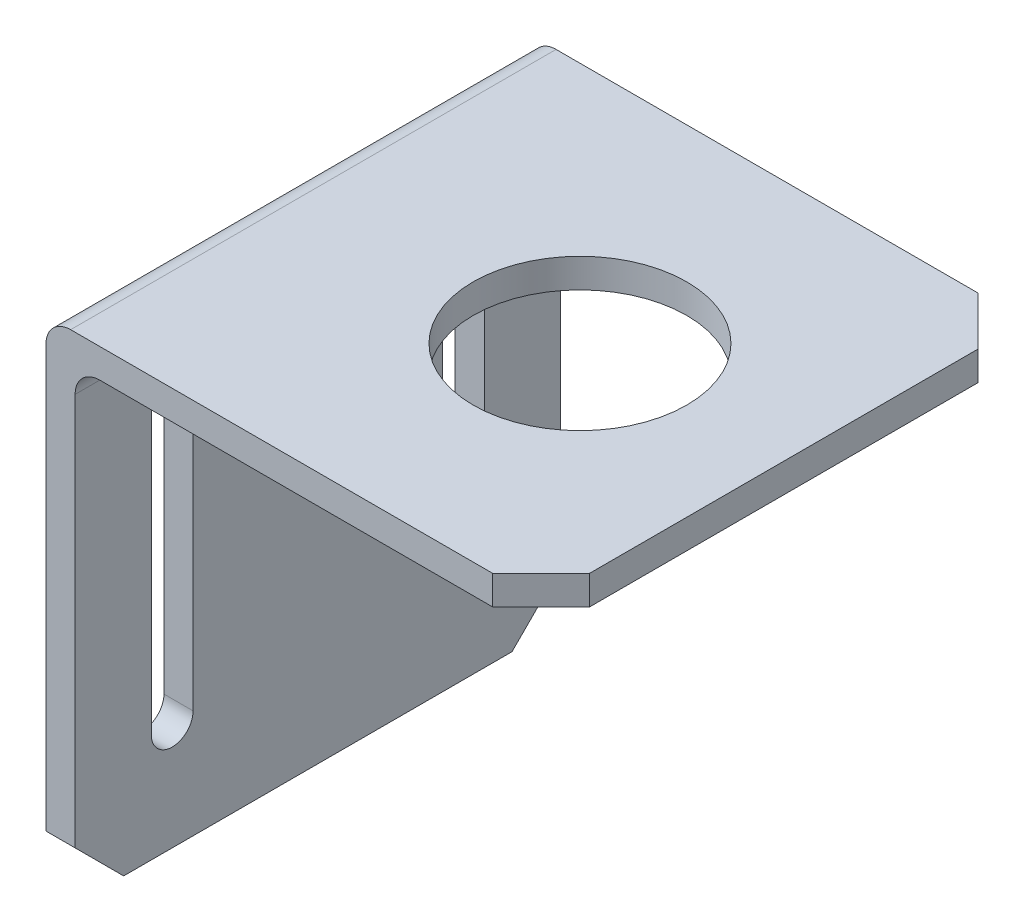
ISO-10303-21;
HEADER;
FILE_DESCRIPTION(('STEP AP214'),'2;1');
FILE_NAME('part.step','',(''),(''),'','','');
FILE_SCHEMA(('AUTOMOTIVE_DESIGN { 1 0 10303 214 1 1 1 1 }'));
ENDSEC;
DATA;
#1=APPLICATION_CONTEXT('core data for automotive mechanical design processes');
#2=APPLICATION_PROTOCOL_DEFINITION('international standard','automotive_design',2000,#1);
#3=PRODUCT_CONTEXT('',#1,'mechanical');
#4=PRODUCT('Part','Part','',(#3));
#5=PRODUCT_RELATED_PRODUCT_CATEGORY('part','',(#4));
#6=PRODUCT_DEFINITION_FORMATION('','',#4);
#7=PRODUCT_DEFINITION_CONTEXT('part definition',#1,'design');
#8=PRODUCT_DEFINITION('design','',#6,#7);
#9=PRODUCT_DEFINITION_SHAPE('','',#8);
#10=(LENGTH_UNIT() NAMED_UNIT(*) SI_UNIT(.MILLI.,.METRE.));
#11=(NAMED_UNIT(*) PLANE_ANGLE_UNIT() SI_UNIT($,.RADIAN.));
#12=(NAMED_UNIT(*) SI_UNIT($,.STERADIAN.) SOLID_ANGLE_UNIT());
#13=UNCERTAINTY_MEASURE_WITH_UNIT(LENGTH_MEASURE(1.E-05),#10,'distance_accuracy_value','');
#14=(GEOMETRIC_REPRESENTATION_CONTEXT(3) GLOBAL_UNCERTAINTY_ASSIGNED_CONTEXT((#13)) GLOBAL_UNIT_ASSIGNED_CONTEXT((#10,
#11,#12)) REPRESENTATION_CONTEXT('',''));
#15=CARTESIAN_POINT('',(0.,0.,0.));
#16=DIRECTION('',(0.,0.,1.));
#17=DIRECTION('',(1.,0.,0.));
#18=AXIS2_PLACEMENT_3D('',#15,#16,#17);
#19=CARTESIAN_POINT('',(-58.9313954198473,15.2778870229008,50.));
#20=DIRECTION('',(1.,0.,0.));
#21=DIRECTION('',(0.,1.,0.));
#22=AXIS2_PLACEMENT_3D('',#19,#20,#21);
#23=PLANE('',#22);
#24=DIRECTION('',(0.,1.,0.));
#25=VECTOR('',#24,1.);
#26=CARTESIAN_POINT('',(-58.9313954198473,15.2778870229008,37.85));
#27=LINE('',#26,#25);
#28=CARTESIAN_POINT('',(-58.9313954198473,-24.5721129770992,37.85));
#29=VERTEX_POINT('',#28);
#30=CARTESIAN_POINT('',(-58.9313954198473,5.12788702290081,37.85));
#31=VERTEX_POINT('',#30);
#32=EDGE_CURVE('E233',#29,#31,#27,.T.);
#33=ORIENTED_EDGE('',*,*,#32,.T.);
#34=CARTESIAN_POINT('',(-58.9313954198473,5.12788702290081,40.));
#35=DIRECTION('',(1.,0.,0.));
#36=DIRECTION('',(0.,1.,0.));
#37=AXIS2_PLACEMENT_3D('',#34,#35,#36);
#38=CIRCLE('',#37,2.14999999999999);
#39=CARTESIAN_POINT('',(-58.9313954198473,5.12788702290081,42.15));
#40=VERTEX_POINT('',#39);
#41=EDGE_CURVE('E236',#31,#40,#38,.T.);
#42=ORIENTED_EDGE('',*,*,#41,.T.);
#43=DIRECTION('',(0.,-1.,0.));
#44=VECTOR('',#43,1.);
#45=CARTESIAN_POINT('',(-58.9313954198473,15.2778870229008,42.15));
#46=LINE('',#45,#44);
#47=CARTESIAN_POINT('',(-58.9313954198473,-24.5721129770992,42.15));
#48=VERTEX_POINT('',#47);
#49=EDGE_CURVE('E230',#40,#48,#46,.T.);
#50=ORIENTED_EDGE('',*,*,#49,.T.);
#51=CARTESIAN_POINT('',(-58.9313954198473,-24.5721129770992,40.));
#52=DIRECTION('',(1.,0.,0.));
#53=DIRECTION('',(0.,1.,0.));
#54=AXIS2_PLACEMENT_3D('',#51,#52,#53);
#55=CIRCLE('',#54,2.14999999999999);
#56=EDGE_CURVE('E173',#48,#29,#55,.T.);
#57=ORIENTED_EDGE('',*,*,#56,.T.);
#58=EDGE_LOOP('',(#33,#42,#50,#57));
#59=FACE_BOUND('',#58,.T.);
#60=DIRECTION('',(0.,1.,0.));
#61=VECTOR('',#60,1.);
#62=CARTESIAN_POINT('',(-58.9313954198473,15.2778870229011,7.85000000000038));
#63=LINE('',#62,#61);
#64=CARTESIAN_POINT('',(-58.9313954198473,-24.5721129770992,7.85000000000009));
#65=VERTEX_POINT('',#64);
#66=CARTESIAN_POINT('',(-58.9313954198473,5.12788702290081,7.85000000000031));
#67=VERTEX_POINT('',#66);
#68=EDGE_CURVE('E224',#65,#67,#63,.T.);
#69=ORIENTED_EDGE('',*,*,#68,.T.);
#70=CARTESIAN_POINT('',(-58.9313954198473,5.12788702290081,10.0000000000003));
#71=DIRECTION('',(1.,0.,0.));
#72=DIRECTION('',(0.,1.,0.));
#73=AXIS2_PLACEMENT_3D('',#70,#71,#72);
#74=CIRCLE('',#73,2.14999999999998);
#75=CARTESIAN_POINT('',(-58.9313954198473,5.12788702290081,12.1500000000003));
#76=VERTEX_POINT('',#75);
#77=EDGE_CURVE('E227',#67,#76,#74,.T.);
#78=ORIENTED_EDGE('',*,*,#77,.T.);
#79=DIRECTION('',(0.,-1.,0.));
#80=VECTOR('',#79,1.);
#81=CARTESIAN_POINT('',(-58.9313954198473,15.2778870229011,12.1500000000003));
#82=LINE('',#81,#80);
#83=CARTESIAN_POINT('',(-58.9313954198473,-24.5721129770992,12.1500000000001));
#84=VERTEX_POINT('',#83);
#85=EDGE_CURVE('E197',#76,#84,#82,.T.);
#86=ORIENTED_EDGE('',*,*,#85,.T.);
#87=CARTESIAN_POINT('',(-58.9313954198473,-24.5721129770992,10.0000000000001));
#88=DIRECTION('',(1.,0.,0.));
#89=DIRECTION('',(0.,1.,0.));
#90=AXIS2_PLACEMENT_3D('',#87,#88,#89);
#91=CIRCLE('',#90,2.14999999999999);
#92=EDGE_CURVE('E221',#84,#65,#91,.T.);
#93=ORIENTED_EDGE('',*,*,#92,.T.);
#94=EDGE_LOOP('',(#69,#78,#86,#93));
#95=FACE_BOUND('',#94,.T.);
#96=DIRECTION('',(0.,-1.,0.));
#97=VECTOR('',#96,1.);
#98=CARTESIAN_POINT('',(-58.9313954198473,15.2778870229008,50.));
#99=LINE('',#98,#97);
#100=CARTESIAN_POINT('',(-58.9313954198473,12.7378870229008,50.));
#101=VERTEX_POINT('',#100);
#102=CARTESIAN_POINT('',(-58.9313954198473,-30.7221129770992,50.));
#103=VERTEX_POINT('',#102);
#104=EDGE_CURVE('E240',#101,#103,#99,.T.);
#105=ORIENTED_EDGE('',*,*,#104,.F.);
#106=DIRECTION('',(0.,0.,-1.));
#107=VECTOR('',#106,1.);
#108=CARTESIAN_POINT('',(-58.9313954198473,12.7378870229008,50.));
#109=LINE('',#108,#107);
#110=CARTESIAN_POINT('',(-58.9313954198473,12.7378870229008,0.));
#111=VERTEX_POINT('',#110);
#112=EDGE_CURVE('E316',#101,#111,#109,.T.);
#113=ORIENTED_EDGE('',*,*,#112,.T.);
#114=DIRECTION('',(0.,-1.,0.));
#115=VECTOR('',#114,1.);
#116=CARTESIAN_POINT('',(-58.9313954198473,15.2778870229008,0.));
#117=LINE('',#116,#115);
#118=CARTESIAN_POINT('',(-58.9313954198473,-30.7221129770992,0.));
#119=VERTEX_POINT('',#118);
#120=EDGE_CURVE('E239',#111,#119,#117,.T.);
#121=ORIENTED_EDGE('',*,*,#120,.T.);
#122=DIRECTION('',(0.,0.707106781186549,-0.707106781186546));
#123=VECTOR('',#122,1.);
#124=CARTESIAN_POINT('',(-58.9313954198473,-35.7221129770992,5.));
#125=LINE('',#124,#123);
#126=CARTESIAN_POINT('',(-58.9313954198473,-35.7221129770992,5.));
#127=VERTEX_POINT('',#126);
#128=EDGE_CURVE('E286',#119,#127,#125,.F.);
#129=ORIENTED_EDGE('',*,*,#128,.T.);
#130=DIRECTION('',(0.,0.,-1.));
#131=VECTOR('',#130,1.);
#132=CARTESIAN_POINT('',(-58.9313954198473,-35.7221129770992,50.));
#133=LINE('',#132,#131);
#134=CARTESIAN_POINT('',(-58.9313954198473,-35.7221129770992,45.));
#135=VERTEX_POINT('',#134);
#136=EDGE_CURVE('E268',#135,#127,#133,.T.);
#137=ORIENTED_EDGE('',*,*,#136,.F.);
#138=DIRECTION('',(0.,0.707106781186546,0.707106781186549));
#139=VECTOR('',#138,1.);
#140=CARTESIAN_POINT('',(-58.9313954198473,-30.7221129770992,50.));
#141=LINE('',#140,#139);
#142=EDGE_CURVE('E288',#135,#103,#141,.T.);
#143=ORIENTED_EDGE('',*,*,#142,.T.);
#144=EDGE_LOOP('',(#105,#113,#121,#129,#137,#143));
#145=FACE_BOUND('',#144,.T.);
#146=ADVANCED_FACE('F32',(#59,#95,#145),#23,.F.);
#147=CARTESIAN_POINT('',(-58.9313954198473,-35.7221129770992,50.));
#148=DIRECTION('',(0.,1.,0.));
#149=DIRECTION('',(0.,0.,1.));
#150=AXIS2_PLACEMENT_3D('',#147,#148,#149);
#151=PLANE('',#150);
#152=DIRECTION('',(0.,0.,-1.));
#153=VECTOR('',#152,1.);
#154=CARTESIAN_POINT('',(-55.9313954198473,-35.7221129770992,50.));
#155=LINE('',#154,#153);
#156=CARTESIAN_POINT('',(-55.9313954198473,-35.7221129770992,45.));
#157=VERTEX_POINT('',#156);
#158=CARTESIAN_POINT('',(-55.9313954198473,-35.7221129770992,5.));
#159=VERTEX_POINT('',#158);
#160=EDGE_CURVE('E265',#157,#159,#155,.T.);
#161=ORIENTED_EDGE('',*,*,#160,.F.);
#162=DIRECTION('',(-1.,0.,0.));
#163=VECTOR('',#162,1.);
#164=CARTESIAN_POINT('',(-58.9313954198473,-35.7221129770992,45.));
#165=LINE('',#164,#163);
#166=EDGE_CURVE('E284',#157,#135,#165,.T.);
#167=ORIENTED_EDGE('',*,*,#166,.T.);
#168=ORIENTED_EDGE('',*,*,#136,.T.);
#169=DIRECTION('',(1.,0.,0.));
#170=VECTOR('',#169,1.);
#171=CARTESIAN_POINT('',(-58.9313954198473,-35.7221129770992,5.));
#172=LINE('',#171,#170);
#173=EDGE_CURVE('E281',#127,#159,#172,.T.);
#174=ORIENTED_EDGE('',*,*,#173,.T.);
#175=EDGE_LOOP('',(#161,#167,#168,#174));
#176=FACE_BOUND('',#175,.T.);
#177=ADVANCED_FACE('F367',(#176),#151,.F.);
#178=CARTESIAN_POINT('',(-55.9313954198473,-35.7221129770992,50.));
#179=DIRECTION('',(-1.,0.,0.));
#180=DIRECTION('',(0.,0.,1.));
#181=AXIS2_PLACEMENT_3D('',#178,#179,#180);
#182=PLANE('',#181);
#183=DIRECTION('',(0.,-1.,0.));
#184=VECTOR('',#183,1.);
#185=CARTESIAN_POINT('',(-55.9313954198473,5.12788702290081,42.15));
#186=LINE('',#185,#184);
#187=CARTESIAN_POINT('',(-55.9313954198473,5.1278870229008,42.15));
#188=VERTEX_POINT('',#187);
#189=CARTESIAN_POINT('',(-55.9313954198473,-24.5721129770992,42.15));
#190=VERTEX_POINT('',#189);
#191=EDGE_CURVE('E180',#188,#190,#186,.T.);
#192=ORIENTED_EDGE('',*,*,#191,.F.);
#193=CARTESIAN_POINT('',(-55.9313954198473,5.12788702290081,40.));
#194=DIRECTION('',(1.,0.,0.));
#195=DIRECTION('',(0.,0.,-1.));
#196=AXIS2_PLACEMENT_3D('',#193,#194,#195);
#197=CIRCLE('',#196,2.14999999999999);
#198=CARTESIAN_POINT('',(-55.9313954198473,5.12788702290081,37.85));
#199=VERTEX_POINT('',#198);
#200=EDGE_CURVE('E185',#199,#188,#197,.T.);
#201=ORIENTED_EDGE('',*,*,#200,.F.);
#202=DIRECTION('',(0.,1.,0.));
#203=VECTOR('',#202,1.);
#204=CARTESIAN_POINT('',(-55.9313954198473,5.12788702290081,37.85));
#205=LINE('',#204,#203);
#206=CARTESIAN_POINT('',(-55.9313954198473,-24.5721129770992,37.85));
#207=VERTEX_POINT('',#206);
#208=EDGE_CURVE('E190',#207,#199,#205,.T.);
#209=ORIENTED_EDGE('',*,*,#208,.F.);
#210=CARTESIAN_POINT('',(-55.9313954198473,-24.5721129770992,40.));
#211=DIRECTION('',(1.,0.,0.));
#212=DIRECTION('',(0.,0.,-1.));
#213=AXIS2_PLACEMENT_3D('',#210,#211,#212);
#214=CIRCLE('',#213,2.14999999999999);
#215=EDGE_CURVE('E170',#190,#207,#214,.T.);
#216=ORIENTED_EDGE('',*,*,#215,.F.);
#217=EDGE_LOOP('',(#192,#201,#209,#216));
#218=FACE_BOUND('',#217,.T.);
#219=DIRECTION('',(0.,-1.,0.));
#220=VECTOR('',#219,1.);
#221=CARTESIAN_POINT('',(-55.9313954198473,5.12788702290081,12.1500000000003));
#222=LINE('',#221,#220);
#223=CARTESIAN_POINT('',(-55.9313954198473,5.1278870229008,12.1500000000003));
#224=VERTEX_POINT('',#223);
#225=CARTESIAN_POINT('',(-55.9313954198473,-24.5721129770992,12.1500000000001));
#226=VERTEX_POINT('',#225);
#227=EDGE_CURVE('E202',#224,#226,#222,.T.);
#228=ORIENTED_EDGE('',*,*,#227,.F.);
#229=CARTESIAN_POINT('',(-55.9313954198473,5.12788702290081,10.0000000000003));
#230=DIRECTION('',(1.,0.,0.));
#231=DIRECTION('',(0.,0.,1.));
#232=AXIS2_PLACEMENT_3D('',#229,#230,#231);
#233=CIRCLE('',#232,2.14999999999998);
#234=CARTESIAN_POINT('',(-55.9313954198473,5.12788702290081,7.85000000000031));
#235=VERTEX_POINT('',#234);
#236=EDGE_CURVE('E200',#235,#224,#233,.T.);
#237=ORIENTED_EDGE('',*,*,#236,.F.);
#238=DIRECTION('',(0.,1.,0.));
#239=VECTOR('',#238,1.);
#240=CARTESIAN_POINT('',(-55.9313954198473,5.12788702290081,7.85000000000031));
#241=LINE('',#240,#239);
#242=CARTESIAN_POINT('',(-55.9313954198473,-24.5721129770992,7.85000000000009));
#243=VERTEX_POINT('',#242);
#244=EDGE_CURVE('E208',#243,#235,#241,.T.);
#245=ORIENTED_EDGE('',*,*,#244,.F.);
#246=CARTESIAN_POINT('',(-55.9313954198473,-24.5721129770992,10.0000000000001));
#247=DIRECTION('',(1.,0.,0.));
#248=DIRECTION('',(0.,0.,1.));
#249=AXIS2_PLACEMENT_3D('',#246,#247,#248);
#250=CIRCLE('',#249,2.14999999999999);
#251=EDGE_CURVE('E205',#226,#243,#250,.T.);
#252=ORIENTED_EDGE('',*,*,#251,.F.);
#253=EDGE_LOOP('',(#228,#237,#245,#252));
#254=FACE_BOUND('',#253,.T.);
#255=DIRECTION('',(0.,1.,0.));
#256=VECTOR('',#255,1.);
#257=CARTESIAN_POINT('',(-55.9313954198473,-35.7221129770992,0.));
#258=LINE('',#257,#256);
#259=CARTESIAN_POINT('',(-55.9313954198473,-30.7221129770992,0.));
#260=VERTEX_POINT('',#259);
#261=CARTESIAN_POINT('',(-55.9313954198473,9.73788702290079,0.));
#262=VERTEX_POINT('',#261);
#263=EDGE_CURVE('E253',#260,#262,#258,.T.);
#264=ORIENTED_EDGE('',*,*,#263,.T.);
#265=DIRECTION('',(0.,0.,-1.));
#266=VECTOR('',#265,1.);
#267=CARTESIAN_POINT('',(-55.9313954198473,9.7378870229008,50.));
#268=LINE('',#267,#266);
#269=CARTESIAN_POINT('',(-55.9313954198473,9.73788702290079,50.));
#270=VERTEX_POINT('',#269);
#271=EDGE_CURVE('E314',#262,#270,#268,.F.);
#272=ORIENTED_EDGE('',*,*,#271,.T.);
#273=DIRECTION('',(0.,1.,0.));
#274=VECTOR('',#273,1.);
#275=CARTESIAN_POINT('',(-55.9313954198473,-35.7221129770992,50.));
#276=LINE('',#275,#274);
#277=CARTESIAN_POINT('',(-55.9313954198473,-30.7221129770992,50.));
#278=VERTEX_POINT('',#277);
#279=EDGE_CURVE('E242',#278,#270,#276,.T.);
#280=ORIENTED_EDGE('',*,*,#279,.F.);
#281=DIRECTION('',(0.,-0.707106781186546,-0.707106781186549));
#282=VECTOR('',#281,1.);
#283=CARTESIAN_POINT('',(-55.9313954198473,-30.7221129770992,50.));
#284=LINE('',#283,#282);
#285=EDGE_CURVE('E279',#278,#157,#284,.T.);
#286=ORIENTED_EDGE('',*,*,#285,.T.);
#287=ORIENTED_EDGE('',*,*,#160,.T.);
#288=DIRECTION('',(0.,-0.707106781186549,0.707106781186546));
#289=VECTOR('',#288,1.);
#290=CARTESIAN_POINT('',(-55.9313954198473,-35.7221129770992,5.));
#291=LINE('',#290,#289);
#292=EDGE_CURVE('E277',#159,#260,#291,.F.);
#293=ORIENTED_EDGE('',*,*,#292,.T.);
#294=EDGE_LOOP('',(#264,#272,#280,#286,#287,#293));
#295=FACE_BOUND('',#294,.T.);
#296=ADVANCED_FACE('F187',(#218,#254,#295),#182,.F.);
#297=CARTESIAN_POINT('',(-55.9313954198473,12.2778870229008,50.));
#298=DIRECTION('',(0.,1.,0.));
#299=DIRECTION('',(0.,0.,1.));
#300=AXIS2_PLACEMENT_3D('',#297,#298,#299);
#301=PLANE('',#300);
#302=CARTESIAN_POINT('',(-28.9313954198473,12.2778870229008,25.));
#303=DIRECTION('',(0.,1.,0.));
#304=DIRECTION('',(0.,0.,1.));
#305=AXIS2_PLACEMENT_3D('',#302,#303,#304);
#306=CIRCLE('',#305,11.);
#307=CARTESIAN_POINT('',(-28.9313954198473,12.2778870229008,36.));
#308=VERTEX_POINT('',#307);
#309=EDGE_CURVE('E203',#308,#308,#306,.F.);
#310=ORIENTED_EDGE('',*,*,#309,.F.);
#311=EDGE_LOOP('',(#310));
#312=FACE_BOUND('',#311,.T.);
#313=DIRECTION('',(1.,0.,0.));
#314=VECTOR('',#313,1.);
#315=CARTESIAN_POINT('',(-55.9313954198473,12.2778870229008,50.));
#316=LINE('',#315,#314);
#317=CARTESIAN_POINT('',(-53.3913954198473,12.2778870229008,50.));
#318=VERTEX_POINT('',#317);
#319=CARTESIAN_POINT('',(-12.9313954198473,12.2778870229008,50.));
#320=VERTEX_POINT('',#319);
#321=EDGE_CURVE('E246',#318,#320,#316,.T.);
#322=ORIENTED_EDGE('',*,*,#321,.F.);
#323=DIRECTION('',(0.,0.,-1.));
#324=VECTOR('',#323,1.);
#325=CARTESIAN_POINT('',(-53.3913954198473,12.2778870229008,0.));
#326=LINE('',#325,#324);
#327=CARTESIAN_POINT('',(-53.3913954198473,12.2778870229008,0.));
#328=VERTEX_POINT('',#327);
#329=EDGE_CURVE('E311',#318,#328,#326,.T.);
#330=ORIENTED_EDGE('',*,*,#329,.T.);
#331=DIRECTION('',(1.,0.,0.));
#332=VECTOR('',#331,1.);
#333=CARTESIAN_POINT('',(-55.9313954198473,12.2778870229008,0.));
#334=LINE('',#333,#332);
#335=CARTESIAN_POINT('',(-12.9313954198473,12.2778870229008,0.));
#336=VERTEX_POINT('',#335);
#337=EDGE_CURVE('E256',#328,#336,#334,.T.);
#338=ORIENTED_EDGE('',*,*,#337,.T.);
#339=DIRECTION('',(-0.707106781186549,0.,-0.707106781186546));
#340=VECTOR('',#339,1.);
#341=CARTESIAN_POINT('',(-7.93139541984728,12.2778870229008,5.));
#342=LINE('',#341,#340);
#343=CARTESIAN_POINT('',(-7.93139541984728,12.2778870229008,5.));
#344=VERTEX_POINT('',#343);
#345=EDGE_CURVE('E309',#336,#344,#342,.F.);
#346=ORIENTED_EDGE('',*,*,#345,.T.);
#347=DIRECTION('',(0.,0.,-1.));
#348=VECTOR('',#347,1.);
#349=CARTESIAN_POINT('',(-7.93139541984728,12.2778870229008,50.));
#350=LINE('',#349,#348);
#351=CARTESIAN_POINT('',(-7.93139541984728,12.2778870229008,45.));
#352=VERTEX_POINT('',#351);
#353=EDGE_CURVE('E262',#352,#344,#350,.T.);
#354=ORIENTED_EDGE('',*,*,#353,.F.);
#355=DIRECTION('',(-0.707106781186546,0.,0.707106781186549));
#356=VECTOR('',#355,1.);
#357=CARTESIAN_POINT('',(-12.9313954198473,12.2778870229008,50.));
#358=LINE('',#357,#356);
#359=EDGE_CURVE('E306',#352,#320,#358,.T.);
#360=ORIENTED_EDGE('',*,*,#359,.T.);
#361=EDGE_LOOP('',(#322,#330,#338,#346,#354,#360));
#362=FACE_BOUND('',#361,.T.);
#363=ADVANCED_FACE('F341',(#312,#362),#301,.F.);
#364=CARTESIAN_POINT('',(-7.93139541984728,12.2778870229008,50.));
#365=DIRECTION('',(-1.,0.,0.));
#366=DIRECTION('',(0.,-1.,0.));
#367=AXIS2_PLACEMENT_3D('',#364,#365,#366);
#368=PLANE('',#367);
#369=ORIENTED_EDGE('',*,*,#353,.T.);
#370=DIRECTION('',(0.,1.,0.));
#371=VECTOR('',#370,1.);
#372=CARTESIAN_POINT('',(-7.93139541984728,12.2778870229008,5.));
#373=LINE('',#372,#371);
#374=CARTESIAN_POINT('',(-7.93139541984728,15.2778870229008,5.));
#375=VERTEX_POINT('',#374);
#376=EDGE_CURVE('E299',#344,#375,#373,.T.);
#377=ORIENTED_EDGE('',*,*,#376,.T.);
#378=DIRECTION('',(0.,0.,-1.));
#379=VECTOR('',#378,1.);
#380=CARTESIAN_POINT('',(-7.93139541984728,15.2778870229008,50.));
#381=LINE('',#380,#379);
#382=CARTESIAN_POINT('',(-7.93139541984728,15.2778870229008,45.));
#383=VERTEX_POINT('',#382);
#384=EDGE_CURVE('E251',#383,#375,#381,.T.);
#385=ORIENTED_EDGE('',*,*,#384,.F.);
#386=DIRECTION('',(0.,-1.,0.));
#387=VECTOR('',#386,1.);
#388=CARTESIAN_POINT('',(-7.93139541984728,12.2778870229008,45.));
#389=LINE('',#388,#387);
#390=EDGE_CURVE('E297',#383,#352,#389,.T.);
#391=ORIENTED_EDGE('',*,*,#390,.T.);
#392=EDGE_LOOP('',(#369,#377,#385,#391));
#393=FACE_BOUND('',#392,.T.);
#394=ADVANCED_FACE('F378',(#393),#368,.F.);
#395=CARTESIAN_POINT('',(-7.93139541984728,15.2778870229008,50.));
#396=DIRECTION('',(0.,-1.,0.));
#397=DIRECTION('',(1.,0.,0.));
#398=AXIS2_PLACEMENT_3D('',#395,#396,#397);
#399=PLANE('',#398);
#400=CARTESIAN_POINT('',(-28.9313954198473,15.2778870229008,25.));
#401=DIRECTION('',(0.,1.,0.));
#402=DIRECTION('',(-1.,0.,0.));
#403=AXIS2_PLACEMENT_3D('',#400,#401,#402);
#404=CIRCLE('',#403,11.);
#405=CARTESIAN_POINT('',(-39.9313954198473,15.2778870229008,25.));
#406=VERTEX_POINT('',#405);
#407=EDGE_CURVE('E579',#406,#406,#404,.T.);
#408=ORIENTED_EDGE('',*,*,#407,.F.);
#409=EDGE_LOOP('',(#408));
#410=FACE_BOUND('',#409,.T.);
#411=DIRECTION('',(-1.,0.,0.));
#412=VECTOR('',#411,1.);
#413=CARTESIAN_POINT('',(-7.93139541984728,15.2778870229008,0.));
#414=LINE('',#413,#412);
#415=CARTESIAN_POINT('',(-12.9313954198473,15.2778870229008,0.));
#416=VERTEX_POINT('',#415);
#417=CARTESIAN_POINT('',(-56.3913954198473,15.2778870229008,0.));
#418=VERTEX_POINT('',#417);
#419=EDGE_CURVE('E243',#416,#418,#414,.T.);
#420=ORIENTED_EDGE('',*,*,#419,.T.);
#421=DIRECTION('',(0.,0.,-1.));
#422=VECTOR('',#421,1.);
#423=CARTESIAN_POINT('',(-56.3913954198473,15.2778870229008,50.));
#424=LINE('',#423,#422);
#425=CARTESIAN_POINT('',(-56.3913954198473,15.2778870229008,50.));
#426=VERTEX_POINT('',#425);
#427=EDGE_CURVE('E321',#418,#426,#424,.F.);
#428=ORIENTED_EDGE('',*,*,#427,.T.);
#429=DIRECTION('',(-1.,0.,0.));
#430=VECTOR('',#429,1.);
#431=CARTESIAN_POINT('',(-7.93139541984728,15.2778870229008,50.));
#432=LINE('',#431,#430);
#433=CARTESIAN_POINT('',(-12.9313954198473,15.2778870229008,50.));
#434=VERTEX_POINT('',#433);
#435=EDGE_CURVE('E248',#434,#426,#432,.T.);
#436=ORIENTED_EDGE('',*,*,#435,.F.);
#437=DIRECTION('',(0.707106781186546,0.,-0.707106781186549));
#438=VECTOR('',#437,1.);
#439=CARTESIAN_POINT('',(-12.9313954198473,15.2778870229008,50.));
#440=LINE('',#439,#438);
#441=EDGE_CURVE('E302',#434,#383,#440,.T.);
#442=ORIENTED_EDGE('',*,*,#441,.T.);
#443=ORIENTED_EDGE('',*,*,#384,.T.);
#444=DIRECTION('',(0.707106781186549,0.,0.707106781186546));
#445=VECTOR('',#444,1.);
#446=CARTESIAN_POINT('',(-7.93139541984728,15.2778870229008,5.00000000000001));
#447=LINE('',#446,#445);
#448=EDGE_CURVE('E304',#375,#416,#447,.F.);
#449=ORIENTED_EDGE('',*,*,#448,.T.);
#450=EDGE_LOOP('',(#420,#428,#436,#442,#443,#449));
#451=FACE_BOUND('',#450,.T.);
#452=ADVANCED_FACE('F351',(#410,#451),#399,.F.);
#453=CARTESIAN_POINT('',(0.,0.,50.));
#454=DIRECTION('',(0.,0.,1.));
#455=DIRECTION('',(1.,0.,0.));
#456=AXIS2_PLACEMENT_3D('',#453,#454,#455);
#457=PLANE('',#456);
#458=ORIENTED_EDGE('',*,*,#435,.T.);
#459=CARTESIAN_POINT('',(-56.3913954198473,12.7378870229008,50.));
#460=DIRECTION('',(0.,0.,1.));
#461=DIRECTION('',(1.,0.,0.));
#462=AXIS2_PLACEMENT_3D('',#459,#460,#461);
#463=CIRCLE('',#462,2.54);
#464=EDGE_CURVE('E323',#426,#101,#463,.T.);
#465=ORIENTED_EDGE('',*,*,#464,.T.);
#466=ORIENTED_EDGE('',*,*,#104,.T.);
#467=DIRECTION('',(1.,0.,0.));
#468=VECTOR('',#467,1.);
#469=CARTESIAN_POINT('',(-55.9313954198473,-30.7221129770992,50.));
#470=LINE('',#469,#468);
#471=EDGE_CURVE('E274',#103,#278,#470,.T.);
#472=ORIENTED_EDGE('',*,*,#471,.T.);
#473=ORIENTED_EDGE('',*,*,#279,.T.);
#474=CARTESIAN_POINT('',(-53.3913954198473,9.7378870229008,50.));
#475=DIRECTION('',(0.,0.,1.));
#476=DIRECTION('',(1.,0.,0.));
#477=AXIS2_PLACEMENT_3D('',#474,#475,#476);
#478=CIRCLE('',#477,2.54);
#479=EDGE_CURVE('E11',#270,#318,#478,.F.);
#480=ORIENTED_EDGE('',*,*,#479,.T.);
#481=ORIENTED_EDGE('',*,*,#321,.T.);
#482=DIRECTION('',(0.,1.,0.));
#483=VECTOR('',#482,1.);
#484=CARTESIAN_POINT('',(-12.9313954198473,15.2778870229008,50.));
#485=LINE('',#484,#483);
#486=EDGE_CURVE('E271',#320,#434,#485,.T.);
#487=ORIENTED_EDGE('',*,*,#486,.T.);
#488=EDGE_LOOP('',(#458,#465,#466,#472,#473,#480,#481,#487));
#489=FACE_BOUND('',#488,.T.);
#490=ADVANCED_FACE('F339',(#489),#457,.T.);
#491=CARTESIAN_POINT('',(0.,0.,0.));
#492=DIRECTION('',(0.,0.,1.));
#493=DIRECTION('',(1.,0.,0.));
#494=AXIS2_PLACEMENT_3D('',#491,#492,#493);
#495=PLANE('',#494);
#496=ORIENTED_EDGE('',*,*,#120,.F.);
#497=CARTESIAN_POINT('',(-56.3913954198473,12.7378870229008,0.));
#498=DIRECTION('',(0.,0.,1.));
#499=DIRECTION('',(1.,0.,0.));
#500=AXIS2_PLACEMENT_3D('',#497,#498,#499);
#501=CIRCLE('',#500,2.54);
#502=EDGE_CURVE('E319',#111,#418,#501,.F.);
#503=ORIENTED_EDGE('',*,*,#502,.T.);
#504=ORIENTED_EDGE('',*,*,#419,.F.);
#505=DIRECTION('',(0.,-1.,0.));
#506=VECTOR('',#505,1.);
#507=CARTESIAN_POINT('',(-12.9313954198473,0.,0.));
#508=LINE('',#507,#506);
#509=EDGE_CURVE('E291',#416,#336,#508,.T.);
#510=ORIENTED_EDGE('',*,*,#509,.T.);
#511=ORIENTED_EDGE('',*,*,#337,.F.);
#512=CARTESIAN_POINT('',(-53.3913954198473,9.7378870229008,0.));
#513=DIRECTION('',(0.,0.,1.));
#514=DIRECTION('',(1.,0.,0.));
#515=AXIS2_PLACEMENT_3D('',#512,#513,#514);
#516=CIRCLE('',#515,2.54);
#517=EDGE_CURVE('E40',#328,#262,#516,.T.);
#518=ORIENTED_EDGE('',*,*,#517,.T.);
#519=ORIENTED_EDGE('',*,*,#263,.F.);
#520=DIRECTION('',(-1.,0.,0.));
#521=VECTOR('',#520,1.);
#522=CARTESIAN_POINT('',(0.,-30.7221129770992,0.));
#523=LINE('',#522,#521);
#524=EDGE_CURVE('E294',#260,#119,#523,.T.);
#525=ORIENTED_EDGE('',*,*,#524,.T.);
#526=EDGE_LOOP('',(#496,#503,#504,#510,#511,#518,#519,#525));
#527=FACE_BOUND('',#526,.T.);
#528=ADVANCED_FACE('F328',(#527),#495,.F.);
#529=CARTESIAN_POINT('',(0.,-30.7221129770992,50.));
#530=DIRECTION('',(0.,-0.707106781186549,0.707106781186546));
#531=DIRECTION('',(-1.,0.,0.));
#532=AXIS2_PLACEMENT_3D('',#529,#530,#531);
#533=PLANE('',#532);
#534=ORIENTED_EDGE('',*,*,#142,.F.);
#535=ORIENTED_EDGE('',*,*,#166,.F.);
#536=ORIENTED_EDGE('',*,*,#285,.F.);
#537=ORIENTED_EDGE('',*,*,#471,.F.);
#538=EDGE_LOOP('',(#534,#535,#536,#537));
#539=FACE_BOUND('',#538,.T.);
#540=ADVANCED_FACE('F364',(#539),#533,.T.);
#541=CARTESIAN_POINT('',(-58.9313954198473,-35.7221129770992,5.));
#542=DIRECTION('',(0.,0.707106781186546,0.707106781186549));
#543=DIRECTION('',(1.,0.,0.));
#544=AXIS2_PLACEMENT_3D('',#541,#542,#543);
#545=PLANE('',#544);
#546=ORIENTED_EDGE('',*,*,#128,.F.);
#547=ORIENTED_EDGE('',*,*,#524,.F.);
#548=ORIENTED_EDGE('',*,*,#292,.F.);
#549=ORIENTED_EDGE('',*,*,#173,.F.);
#550=EDGE_LOOP('',(#546,#547,#548,#549));
#551=FACE_BOUND('',#550,.T.);
#552=ADVANCED_FACE('F371',(#551),#545,.F.);
#553=CARTESIAN_POINT('',(-7.93139541984728,12.2778870229008,5.));
#554=DIRECTION('',(-0.707106781186546,0.,0.707106781186549));
#555=DIRECTION('',(0.,1.,0.));
#556=AXIS2_PLACEMENT_3D('',#553,#554,#555);
#557=PLANE('',#556);
#558=ORIENTED_EDGE('',*,*,#345,.F.);
#559=ORIENTED_EDGE('',*,*,#509,.F.);
#560=ORIENTED_EDGE('',*,*,#448,.F.);
#561=ORIENTED_EDGE('',*,*,#376,.F.);
#562=EDGE_LOOP('',(#558,#559,#560,#561));
#563=FACE_BOUND('',#562,.T.);
#564=ADVANCED_FACE('F375',(#563),#557,.F.);
#565=CARTESIAN_POINT('',(-12.9313954198473,0.,50.));
#566=DIRECTION('',(0.707106781186549,0.,0.707106781186546));
#567=DIRECTION('',(0.,-1.,0.));
#568=AXIS2_PLACEMENT_3D('',#565,#566,#567);
#569=PLANE('',#568);
#570=ORIENTED_EDGE('',*,*,#359,.F.);
#571=ORIENTED_EDGE('',*,*,#390,.F.);
#572=ORIENTED_EDGE('',*,*,#441,.F.);
#573=ORIENTED_EDGE('',*,*,#486,.F.);
#574=EDGE_LOOP('',(#570,#571,#572,#573));
#575=FACE_BOUND('',#574,.T.);
#576=ADVANCED_FACE('F347',(#575),#569,.T.);
#577=CARTESIAN_POINT('',(-53.3913954198473,9.7378870229008,50.));
#578=DIRECTION('',(0.,0.,1.));
#579=DIRECTION('',(1.,0.,0.));
#580=AXIS2_PLACEMENT_3D('',#577,#578,#579);
#581=CYLINDRICAL_SURFACE('',#580,2.54);
#582=ORIENTED_EDGE('',*,*,#479,.F.);
#583=ORIENTED_EDGE('',*,*,#271,.F.);
#584=ORIENTED_EDGE('',*,*,#517,.F.);
#585=ORIENTED_EDGE('',*,*,#329,.F.);
#586=EDGE_LOOP('',(#582,#583,#584,#585));
#587=FACE_BOUND('',#586,.T.);
#588=ADVANCED_FACE('F336',(#587),#581,.F.);
#589=CARTESIAN_POINT('',(-56.3913954198473,12.7378870229008,50.));
#590=DIRECTION('',(0.,0.,-1.));
#591=DIRECTION('',(-1.,0.,0.));
#592=AXIS2_PLACEMENT_3D('',#589,#590,#591);
#593=CYLINDRICAL_SURFACE('',#592,2.54);
#594=ORIENTED_EDGE('',*,*,#464,.F.);
#595=ORIENTED_EDGE('',*,*,#427,.F.);
#596=ORIENTED_EDGE('',*,*,#502,.F.);
#597=ORIENTED_EDGE('',*,*,#112,.F.);
#598=EDGE_LOOP('',(#594,#595,#596,#597));
#599=FACE_BOUND('',#598,.T.);
#600=ADVANCED_FACE('F34',(#599),#593,.T.);
#601=CARTESIAN_POINT('',(-105.931395419847,5.12788702290081,10.0000000000003));
#602=DIRECTION('',(1.,0.,0.));
#603=DIRECTION('',(0.,0.,-1.));
#604=AXIS2_PLACEMENT_3D('',#601,#602,#603);
#605=CYLINDRICAL_SURFACE('',#604,2.14999999999998);
#606=DIRECTION('',(1.,0.,0.));
#607=VECTOR('',#606,1.);
#608=CARTESIAN_POINT('',(-105.931395419847,5.12788702290081,7.85000000000031));
#609=LINE('',#608,#607);
#610=EDGE_CURVE('E212',#67,#235,#609,.T.);
#611=ORIENTED_EDGE('',*,*,#610,.T.);
#612=ORIENTED_EDGE('',*,*,#236,.T.);
#613=DIRECTION('',(1.,0.,0.));
#614=VECTOR('',#613,1.);
#615=CARTESIAN_POINT('',(-105.931395419847,5.12788702290081,12.1500000000003));
#616=LINE('',#615,#614);
#617=EDGE_CURVE('E211',#76,#224,#616,.T.);
#618=ORIENTED_EDGE('',*,*,#617,.F.);
#619=ORIENTED_EDGE('',*,*,#77,.F.);
#620=EDGE_LOOP('',(#611,#612,#618,#619));
#621=FACE_BOUND('',#620,.T.);
#622=ADVANCED_FACE('F410',(#621),#605,.F.);
#623=CARTESIAN_POINT('',(-105.931395419847,5.12788702290081,7.85000000000031));
#624=DIRECTION('',(0.,0.,-1.));
#625=DIRECTION('',(0.,1.,0.));
#626=AXIS2_PLACEMENT_3D('',#623,#624,#625);
#627=PLANE('',#626);
#628=DIRECTION('',(1.,0.,0.));
#629=VECTOR('',#628,1.);
#630=CARTESIAN_POINT('',(-105.931395419847,-24.5721129770992,7.85000000000009));
#631=LINE('',#630,#629);
#632=EDGE_CURVE('E214',#65,#243,#631,.T.);
#633=ORIENTED_EDGE('',*,*,#632,.T.);
#634=ORIENTED_EDGE('',*,*,#244,.T.);
#635=ORIENTED_EDGE('',*,*,#610,.F.);
#636=ORIENTED_EDGE('',*,*,#68,.F.);
#637=EDGE_LOOP('',(#633,#634,#635,#636));
#638=FACE_BOUND('',#637,.T.);
#639=ADVANCED_FACE('F414',(#638),#627,.F.);
#640=CARTESIAN_POINT('',(-105.931395419847,-24.5721129770992,10.0000000000001));
#641=DIRECTION('',(1.,0.,0.));
#642=DIRECTION('',(0.,0.,-1.));
#643=AXIS2_PLACEMENT_3D('',#640,#641,#642);
#644=CYLINDRICAL_SURFACE('',#643,2.14999999999999);
#645=DIRECTION('',(1.,0.,0.));
#646=VECTOR('',#645,1.);
#647=CARTESIAN_POINT('',(-105.931395419847,-24.5721129770992,12.1500000000001));
#648=LINE('',#647,#646);
#649=EDGE_CURVE('E55',#84,#226,#648,.T.);
#650=ORIENTED_EDGE('',*,*,#649,.T.);
#651=ORIENTED_EDGE('',*,*,#251,.T.);
#652=ORIENTED_EDGE('',*,*,#632,.F.);
#653=ORIENTED_EDGE('',*,*,#92,.F.);
#654=EDGE_LOOP('',(#650,#651,#652,#653));
#655=FACE_BOUND('',#654,.T.);
#656=ADVANCED_FACE('F420',(#655),#644,.F.);
#657=CARTESIAN_POINT('',(-105.931395419847,5.12788702290081,12.1500000000003));
#658=DIRECTION('',(0.,0.,1.));
#659=DIRECTION('',(0.,-1.,0.));
#660=AXIS2_PLACEMENT_3D('',#657,#658,#659);
#661=PLANE('',#660);
#662=ORIENTED_EDGE('',*,*,#617,.T.);
#663=ORIENTED_EDGE('',*,*,#227,.T.);
#664=ORIENTED_EDGE('',*,*,#649,.F.);
#665=ORIENTED_EDGE('',*,*,#85,.F.);
#666=EDGE_LOOP('',(#662,#663,#664,#665));
#667=FACE_BOUND('',#666,.T.);
#668=ADVANCED_FACE('F425',(#667),#661,.F.);
#669=CARTESIAN_POINT('',(-105.931395419847,5.12788702290081,40.));
#670=DIRECTION('',(1.,0.,0.));
#671=DIRECTION('',(0.,0.,-1.));
#672=AXIS2_PLACEMENT_3D('',#669,#670,#671);
#673=CYLINDRICAL_SURFACE('',#672,2.14999999999999);
#674=DIRECTION('',(1.,0.,0.));
#675=VECTOR('',#674,1.);
#676=CARTESIAN_POINT('',(-105.931395419847,5.12788702290081,37.85));
#677=LINE('',#676,#675);
#678=EDGE_CURVE('E195',#31,#199,#677,.T.);
#679=ORIENTED_EDGE('',*,*,#678,.T.);
#680=ORIENTED_EDGE('',*,*,#200,.T.);
#681=DIRECTION('',(1.,0.,0.));
#682=VECTOR('',#681,1.);
#683=CARTESIAN_POINT('',(-105.931395419847,5.12788702290081,42.15));
#684=LINE('',#683,#682);
#685=EDGE_CURVE('E176',#40,#188,#684,.T.);
#686=ORIENTED_EDGE('',*,*,#685,.F.);
#687=ORIENTED_EDGE('',*,*,#41,.F.);
#688=EDGE_LOOP('',(#679,#680,#686,#687));
#689=FACE_BOUND('',#688,.T.);
#690=ADVANCED_FACE('F527',(#689),#673,.F.);
#691=CARTESIAN_POINT('',(-105.931395419847,5.12788702290081,37.85));
#692=DIRECTION('',(0.,0.,-1.));
#693=DIRECTION('',(0.,1.,0.));
#694=AXIS2_PLACEMENT_3D('',#691,#692,#693);
#695=PLANE('',#694);
#696=DIRECTION('',(1.,0.,0.));
#697=VECTOR('',#696,1.);
#698=CARTESIAN_POINT('',(-105.931395419847,-24.5721129770992,37.85));
#699=LINE('',#698,#697);
#700=EDGE_CURVE('E175',#29,#207,#699,.T.);
#701=ORIENTED_EDGE('',*,*,#700,.T.);
#702=ORIENTED_EDGE('',*,*,#208,.T.);
#703=ORIENTED_EDGE('',*,*,#678,.F.);
#704=ORIENTED_EDGE('',*,*,#32,.F.);
#705=EDGE_LOOP('',(#701,#702,#703,#704));
#706=FACE_BOUND('',#705,.T.);
#707=ADVANCED_FACE('F534',(#706),#695,.F.);
#708=CARTESIAN_POINT('',(-105.931395419847,-24.5721129770992,40.));
#709=DIRECTION('',(1.,0.,0.));
#710=DIRECTION('',(0.,0.,-1.));
#711=AXIS2_PLACEMENT_3D('',#708,#709,#710);
#712=CYLINDRICAL_SURFACE('',#711,2.14999999999999);
#713=DIRECTION('',(1.,0.,0.));
#714=VECTOR('',#713,1.);
#715=CARTESIAN_POINT('',(-105.931395419847,-24.5721129770992,42.15));
#716=LINE('',#715,#714);
#717=EDGE_CURVE('E47',#48,#190,#716,.T.);
#718=ORIENTED_EDGE('',*,*,#717,.T.);
#719=ORIENTED_EDGE('',*,*,#215,.T.);
#720=ORIENTED_EDGE('',*,*,#700,.F.);
#721=ORIENTED_EDGE('',*,*,#56,.F.);
#722=EDGE_LOOP('',(#718,#719,#720,#721));
#723=FACE_BOUND('',#722,.T.);
#724=ADVANCED_FACE('F167',(#723),#712,.F.);
#725=CARTESIAN_POINT('',(-105.931395419847,5.12788702290081,42.15));
#726=DIRECTION('',(0.,0.,1.));
#727=DIRECTION('',(1.,0.,0.));
#728=AXIS2_PLACEMENT_3D('',#725,#726,#727);
#729=PLANE('',#728);
#730=ORIENTED_EDGE('',*,*,#685,.T.);
#731=ORIENTED_EDGE('',*,*,#191,.T.);
#732=ORIENTED_EDGE('',*,*,#717,.F.);
#733=ORIENTED_EDGE('',*,*,#49,.F.);
#734=EDGE_LOOP('',(#730,#731,#732,#733));
#735=FACE_BOUND('',#734,.T.);
#736=ADVANCED_FACE('F181',(#735),#729,.F.);
#737=CARTESIAN_POINT('',(-28.9313954198473,-18.8348113493073,25.));
#738=DIRECTION('',(0.,1.,0.));
#739=DIRECTION('',(-1.,0.,0.));
#740=AXIS2_PLACEMENT_3D('',#737,#738,#739);
#741=CYLINDRICAL_SURFACE('',#740,11.);
#742=ORIENTED_EDGE('',*,*,#309,.T.);
#743=EDGE_LOOP('',(#742));
#744=FACE_BOUND('',#743,.T.);
#745=ORIENTED_EDGE('',*,*,#407,.T.);
#746=EDGE_LOOP('',(#745));
#747=FACE_BOUND('',#746,.T.);
#748=ADVANCED_FACE('F557',(#744,#747),#741,.F.);
#749=CLOSED_SHELL('',(#146,#177,#296,#363,#394,#452,#490,#528,#540,#552,#564,#576,#588,#600,
#622,#639,#656,#668,#690,#707,#724,#736,#748));
#750=MANIFOLD_SOLID_BREP('B2',#749);
#751=ADVANCED_BREP_SHAPE_REPRESENTATION('',(#18,#750),#14);
#752=SHAPE_DEFINITION_REPRESENTATION(#9,#751);
ENDSEC;
END-ISO-10303-21;
